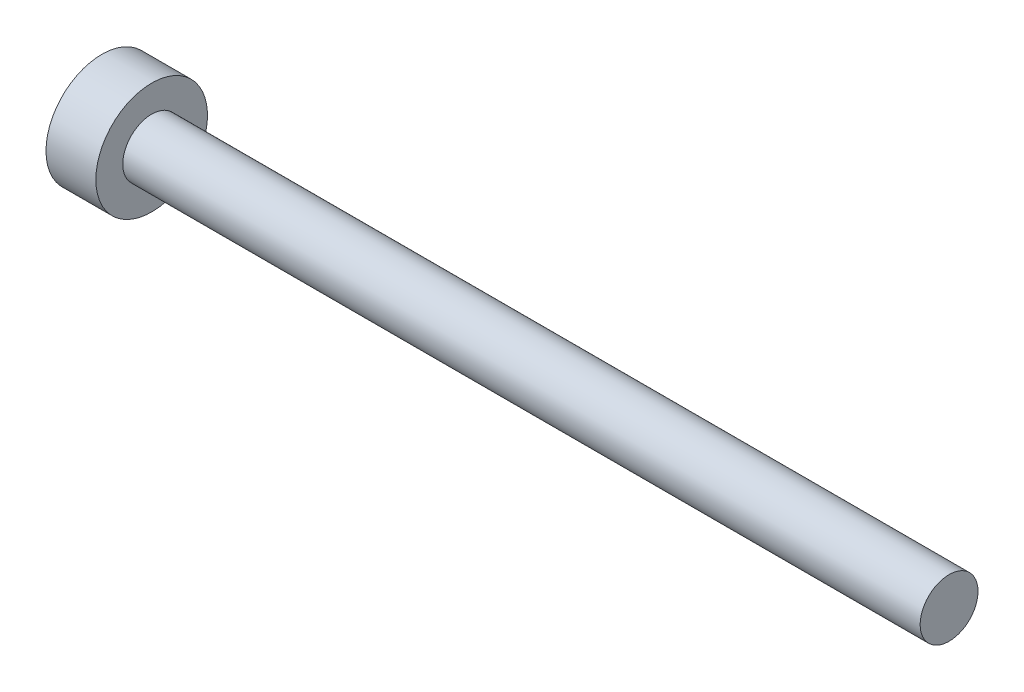
ISO-10303-21;
HEADER;
FILE_DESCRIPTION(('STEP AP214'),'2;1');
FILE_NAME('part.step','',(''),(''),'','','');
FILE_SCHEMA(('AUTOMOTIVE_DESIGN { 1 0 10303 214 1 1 1 1 }'));
ENDSEC;
DATA;
#1=APPLICATION_CONTEXT('core data for automotive mechanical design processes');
#2=APPLICATION_PROTOCOL_DEFINITION('international standard','automotive_design',2000,#1);
#3=PRODUCT_CONTEXT('',#1,'mechanical');
#4=PRODUCT('Part','Part','',(#3));
#5=PRODUCT_RELATED_PRODUCT_CATEGORY('part','',(#4));
#6=PRODUCT_DEFINITION_FORMATION('','',#4);
#7=PRODUCT_DEFINITION_CONTEXT('part definition',#1,'design');
#8=PRODUCT_DEFINITION('design','',#6,#7);
#9=PRODUCT_DEFINITION_SHAPE('','',#8);
#10=(LENGTH_UNIT() NAMED_UNIT(*) SI_UNIT(.MILLI.,.METRE.));
#11=(NAMED_UNIT(*) PLANE_ANGLE_UNIT() SI_UNIT($,.RADIAN.));
#12=(NAMED_UNIT(*) SI_UNIT($,.STERADIAN.) SOLID_ANGLE_UNIT());
#13=UNCERTAINTY_MEASURE_WITH_UNIT(LENGTH_MEASURE(1.E-05),#10,'distance_accuracy_value','');
#14=(GEOMETRIC_REPRESENTATION_CONTEXT(3) GLOBAL_UNCERTAINTY_ASSIGNED_CONTEXT((#13)) GLOBAL_UNIT_ASSIGNED_CONTEXT((#10,
#11,#12)) REPRESENTATION_CONTEXT('',''));
#15=CARTESIAN_POINT('',(0.,0.,0.));
#16=DIRECTION('',(0.,0.,1.));
#17=DIRECTION('',(1.,0.,0.));
#18=AXIS2_PLACEMENT_3D('',#15,#16,#17);
#19=CARTESIAN_POINT('',(40.,0.,0.));
#20=DIRECTION('',(-1.,0.,0.));
#21=DIRECTION('',(0.,0.,1.));
#22=AXIS2_PLACEMENT_3D('',#19,#20,#21);
#23=CYLINDRICAL_SURFACE('',#22,1.45);
#24=CARTESIAN_POINT('',(40.,0.,0.));
#25=DIRECTION('',(1.,0.,0.));
#26=DIRECTION('',(0.,0.,-1.));
#27=AXIS2_PLACEMENT_3D('',#24,#25,#26);
#28=CIRCLE('',#27,1.45);
#29=CARTESIAN_POINT('',(40.,0.,-1.45));
#30=VERTEX_POINT('',#29);
#31=EDGE_CURVE('E11',#30,#30,#28,.T.);
#32=ORIENTED_EDGE('',*,*,#31,.F.);
#33=EDGE_LOOP('',(#32));
#34=FACE_BOUND('',#33,.T.);
#35=CARTESIAN_POINT('',(0.,0.,0.));
#36=DIRECTION('',(1.,0.,0.));
#37=DIRECTION('',(0.,0.,-1.));
#38=AXIS2_PLACEMENT_3D('',#35,#36,#37);
#39=CIRCLE('',#38,1.45);
#40=CARTESIAN_POINT('',(0.,0.,-1.45));
#41=VERTEX_POINT('',#40);
#42=EDGE_CURVE('E46',#41,#41,#39,.T.);
#43=ORIENTED_EDGE('',*,*,#42,.T.);
#44=EDGE_LOOP('',(#43));
#45=FACE_BOUND('',#44,.T.);
#46=ADVANCED_FACE('F43',(#34,#45),#23,.T.);
#47=CARTESIAN_POINT('',(40.,0.,0.));
#48=DIRECTION('',(1.,0.,0.));
#49=DIRECTION('',(0.,0.,-1.));
#50=AXIS2_PLACEMENT_3D('',#47,#48,#49);
#51=PLANE('',#50);
#52=ORIENTED_EDGE('',*,*,#31,.T.);
#53=EDGE_LOOP('',(#52));
#54=FACE_BOUND('',#53,.T.);
#55=ADVANCED_FACE('F194',(#54),#51,.T.);
#56=CARTESIAN_POINT('',(-2.5,0.,0.));
#57=DIRECTION('',(1.,0.,0.));
#58=DIRECTION('',(0.,0.,-1.));
#59=AXIS2_PLACEMENT_3D('',#56,#57,#58);
#60=CYLINDRICAL_SURFACE('',#59,2.8);
#61=CARTESIAN_POINT('',(-2.5,0.,0.));
#62=DIRECTION('',(-1.,0.,0.));
#63=DIRECTION('',(0.,0.,1.));
#64=AXIS2_PLACEMENT_3D('',#61,#62,#63);
#65=CIRCLE('',#64,2.8);
#66=CARTESIAN_POINT('',(-2.5,0.,2.8));
#67=VERTEX_POINT('',#66);
#68=EDGE_CURVE('E167',#67,#67,#65,.T.);
#69=ORIENTED_EDGE('',*,*,#68,.F.);
#70=EDGE_LOOP('',(#69));
#71=FACE_BOUND('',#70,.T.);
#72=CARTESIAN_POINT('',(0.,0.,0.));
#73=DIRECTION('',(-1.,0.,0.));
#74=DIRECTION('',(0.,0.,1.));
#75=AXIS2_PLACEMENT_3D('',#72,#73,#74);
#76=CIRCLE('',#75,2.8);
#77=CARTESIAN_POINT('',(0.,0.,2.8));
#78=VERTEX_POINT('',#77);
#79=EDGE_CURVE('E157',#78,#78,#76,.T.);
#80=ORIENTED_EDGE('',*,*,#79,.T.);
#81=EDGE_LOOP('',(#80));
#82=FACE_BOUND('',#81,.T.);
#83=ADVANCED_FACE('F175',(#71,#82),#60,.T.);
#84=CARTESIAN_POINT('',(-2.5,0.,0.));
#85=DIRECTION('',(-1.,0.,0.));
#86=DIRECTION('',(0.,0.,1.));
#87=AXIS2_PLACEMENT_3D('',#84,#85,#86);
#88=PLANE('',#87);
#89=DIRECTION('',(0.,0.,1.));
#90=VECTOR('',#89,1.);
#91=CARTESIAN_POINT('',(-2.5,-1.5,-0.86602540378444));
#92=LINE('',#91,#90);
#93=CARTESIAN_POINT('',(-2.5,-1.5,-0.86602540378444));
#94=VERTEX_POINT('',#93);
#95=CARTESIAN_POINT('',(-2.5,-1.5,0.866025403784439));
#96=VERTEX_POINT('',#95);
#97=EDGE_CURVE('E58',#94,#96,#92,.T.);
#98=ORIENTED_EDGE('',*,*,#97,.F.);
#99=DIRECTION('',(0.,-0.866025403784439,0.5));
#100=VECTOR('',#99,1.);
#101=CARTESIAN_POINT('',(-2.5,0.,-1.73205080756888));
#102=LINE('',#101,#100);
#103=CARTESIAN_POINT('',(-2.5,0.,-1.73205080756888));
#104=VERTEX_POINT('',#103);
#105=EDGE_CURVE('E151',#104,#94,#102,.T.);
#106=ORIENTED_EDGE('',*,*,#105,.F.);
#107=DIRECTION('',(0.,-0.866025403784438,-0.5));
#108=VECTOR('',#107,1.);
#109=CARTESIAN_POINT('',(-2.5,1.5,-0.866025403784439));
#110=LINE('',#109,#108);
#111=CARTESIAN_POINT('',(-2.5,1.5,-0.866025403784439));
#112=VERTEX_POINT('',#111);
#113=EDGE_CURVE('E148',#112,#104,#110,.T.);
#114=ORIENTED_EDGE('',*,*,#113,.F.);
#115=DIRECTION('',(0.,0.,-1.));
#116=VECTOR('',#115,1.);
#117=CARTESIAN_POINT('',(-2.5,1.5,0.866025403784438));
#118=LINE('',#117,#116);
#119=CARTESIAN_POINT('',(-2.5,1.5,0.866025403784438));
#120=VERTEX_POINT('',#119);
#121=EDGE_CURVE('E106',#120,#112,#118,.T.);
#122=ORIENTED_EDGE('',*,*,#121,.F.);
#123=DIRECTION('',(0.,0.866025403784439,-0.5));
#124=VECTOR('',#123,1.);
#125=CARTESIAN_POINT('',(-2.5,0.,1.73205080756888));
#126=LINE('',#125,#124);
#127=CARTESIAN_POINT('',(-2.5,0.,1.73205080756888));
#128=VERTEX_POINT('',#127);
#129=EDGE_CURVE('E142',#128,#120,#126,.T.);
#130=ORIENTED_EDGE('',*,*,#129,.F.);
#131=DIRECTION('',(0.,0.866025403784438,0.500000000000001));
#132=VECTOR('',#131,1.);
#133=CARTESIAN_POINT('',(-2.5,-1.5,0.866025403784438));
#134=LINE('',#133,#132);
#135=EDGE_CURVE('E138',#96,#128,#134,.T.);
#136=ORIENTED_EDGE('',*,*,#135,.F.);
#137=EDGE_LOOP('',(#98,#106,#114,#122,#130,#136));
#138=FACE_BOUND('',#137,.T.);
#139=ORIENTED_EDGE('',*,*,#68,.T.);
#140=EDGE_LOOP('',(#139));
#141=FACE_BOUND('',#140,.T.);
#142=ADVANCED_FACE('F180',(#138,#141),#88,.T.);
#143=CARTESIAN_POINT('',(0.,0.,0.));
#144=DIRECTION('',(-1.,0.,0.));
#145=DIRECTION('',(0.,0.,1.));
#146=AXIS2_PLACEMENT_3D('',#143,#144,#145);
#147=PLANE('',#146);
#148=ORIENTED_EDGE('',*,*,#42,.F.);
#149=EDGE_LOOP('',(#148));
#150=FACE_BOUND('',#149,.T.);
#151=ORIENTED_EDGE('',*,*,#79,.F.);
#152=EDGE_LOOP('',(#151));
#153=FACE_BOUND('',#152,.T.);
#154=ADVANCED_FACE('F177',(#150,#153),#147,.F.);
#155=CARTESIAN_POINT('',(-0.5,-1.5,-0.86602540378444));
#156=DIRECTION('',(0.,-1.,0.));
#157=DIRECTION('',(0.,0.,-1.));
#158=AXIS2_PLACEMENT_3D('',#155,#156,#157);
#159=PLANE('',#158);
#160=ORIENTED_EDGE('',*,*,#97,.T.);
#161=DIRECTION('',(-1.,0.,0.));
#162=VECTOR('',#161,1.);
#163=CARTESIAN_POINT('',(-0.5,-1.5,0.866025403784438));
#164=LINE('',#163,#162);
#165=CARTESIAN_POINT('',(-0.5,-1.5,0.866025403784438));
#166=VERTEX_POINT('',#165);
#167=EDGE_CURVE('E88',#166,#96,#164,.T.);
#168=ORIENTED_EDGE('',*,*,#167,.F.);
#169=DIRECTION('',(0.,0.,1.));
#170=VECTOR('',#169,1.);
#171=CARTESIAN_POINT('',(-0.5,-1.5,-0.86602540378444));
#172=LINE('',#171,#170);
#173=CARTESIAN_POINT('',(-0.5,-1.5,-0.86602540378444));
#174=VERTEX_POINT('',#173);
#175=EDGE_CURVE('E154',#174,#166,#172,.T.);
#176=ORIENTED_EDGE('',*,*,#175,.F.);
#177=DIRECTION('',(-1.,0.,0.));
#178=VECTOR('',#177,1.);
#179=CARTESIAN_POINT('',(-0.5,-1.5,-0.86602540378444));
#180=LINE('',#179,#178);
#181=EDGE_CURVE('E66',#174,#94,#180,.T.);
#182=ORIENTED_EDGE('',*,*,#181,.T.);
#183=EDGE_LOOP('',(#160,#168,#176,#182));
#184=FACE_BOUND('',#183,.T.);
#185=ADVANCED_FACE('F179',(#184),#159,.F.);
#186=CARTESIAN_POINT('',(-0.5,0.,-1.73205080756888));
#187=DIRECTION('',(0.,-0.5,-0.866025403784439));
#188=DIRECTION('',(0.,0.866025403784439,-0.5));
#189=AXIS2_PLACEMENT_3D('',#186,#187,#188);
#190=PLANE('',#189);
#191=ORIENTED_EDGE('',*,*,#105,.T.);
#192=ORIENTED_EDGE('',*,*,#181,.F.);
#193=DIRECTION('',(0.,-0.866025403784439,0.5));
#194=VECTOR('',#193,1.);
#195=CARTESIAN_POINT('',(-0.5,0.,-1.73205080756888));
#196=LINE('',#195,#194);
#197=CARTESIAN_POINT('',(-0.5,0.,-1.73205080756888));
#198=VERTEX_POINT('',#197);
#199=EDGE_CURVE('E120',#198,#174,#196,.T.);
#200=ORIENTED_EDGE('',*,*,#199,.F.);
#201=DIRECTION('',(-1.,0.,0.));
#202=VECTOR('',#201,1.);
#203=CARTESIAN_POINT('',(-0.5,0.,-1.73205080756888));
#204=LINE('',#203,#202);
#205=EDGE_CURVE('E111',#198,#104,#204,.T.);
#206=ORIENTED_EDGE('',*,*,#205,.T.);
#207=EDGE_LOOP('',(#191,#192,#200,#206));
#208=FACE_BOUND('',#207,.T.);
#209=ADVANCED_FACE('F187',(#208),#190,.F.);
#210=CARTESIAN_POINT('',(-0.5,1.5,-0.866025403784439));
#211=DIRECTION('',(0.,0.5,-0.866025403784438));
#212=DIRECTION('',(0.,0.866025403784438,0.5));
#213=AXIS2_PLACEMENT_3D('',#210,#211,#212);
#214=PLANE('',#213);
#215=ORIENTED_EDGE('',*,*,#113,.T.);
#216=ORIENTED_EDGE('',*,*,#205,.F.);
#217=DIRECTION('',(0.,-0.866025403784438,-0.5));
#218=VECTOR('',#217,1.);
#219=CARTESIAN_POINT('',(-0.5,1.5,-0.866025403784439));
#220=LINE('',#219,#218);
#221=CARTESIAN_POINT('',(-0.5,1.5,-0.866025403784439));
#222=VERTEX_POINT('',#221);
#223=EDGE_CURVE('E115',#222,#198,#220,.T.);
#224=ORIENTED_EDGE('',*,*,#223,.F.);
#225=DIRECTION('',(-1.,0.,0.));
#226=VECTOR('',#225,1.);
#227=CARTESIAN_POINT('',(-0.5,1.5,-0.866025403784439));
#228=LINE('',#227,#226);
#229=EDGE_CURVE('E99',#222,#112,#228,.T.);
#230=ORIENTED_EDGE('',*,*,#229,.T.);
#231=EDGE_LOOP('',(#215,#216,#224,#230));
#232=FACE_BOUND('',#231,.T.);
#233=ADVANCED_FACE('F116',(#232),#214,.F.);
#234=CARTESIAN_POINT('',(-0.5,1.5,0.866025403784438));
#235=DIRECTION('',(0.,1.,0.));
#236=DIRECTION('',(0.,0.,1.));
#237=AXIS2_PLACEMENT_3D('',#234,#235,#236);
#238=PLANE('',#237);
#239=ORIENTED_EDGE('',*,*,#121,.T.);
#240=ORIENTED_EDGE('',*,*,#229,.F.);
#241=DIRECTION('',(0.,0.,-1.));
#242=VECTOR('',#241,1.);
#243=CARTESIAN_POINT('',(-0.5,1.5,0.866025403784438));
#244=LINE('',#243,#242);
#245=CARTESIAN_POINT('',(-0.5,1.5,0.866025403784438));
#246=VERTEX_POINT('',#245);
#247=EDGE_CURVE('E103',#246,#222,#244,.T.);
#248=ORIENTED_EDGE('',*,*,#247,.F.);
#249=DIRECTION('',(-1.,0.,0.));
#250=VECTOR('',#249,1.);
#251=CARTESIAN_POINT('',(-0.5,1.5,0.866025403784438));
#252=LINE('',#251,#250);
#253=EDGE_CURVE('E112',#246,#120,#252,.T.);
#254=ORIENTED_EDGE('',*,*,#253,.T.);
#255=EDGE_LOOP('',(#239,#240,#248,#254));
#256=FACE_BOUND('',#255,.T.);
#257=ADVANCED_FACE('F101',(#256),#238,.F.);
#258=CARTESIAN_POINT('',(-0.5,0.,1.73205080756888));
#259=DIRECTION('',(0.,0.5,0.866025403784439));
#260=DIRECTION('',(0.,-0.866025403784439,0.5));
#261=AXIS2_PLACEMENT_3D('',#258,#259,#260);
#262=PLANE('',#261);
#263=ORIENTED_EDGE('',*,*,#129,.T.);
#264=ORIENTED_EDGE('',*,*,#253,.F.);
#265=DIRECTION('',(0.,0.866025403784439,-0.5));
#266=VECTOR('',#265,1.);
#267=CARTESIAN_POINT('',(-0.5,0.,1.73205080756888));
#268=LINE('',#267,#266);
#269=CARTESIAN_POINT('',(-0.5,0.,1.73205080756888));
#270=VERTEX_POINT('',#269);
#271=EDGE_CURVE('E126',#270,#246,#268,.T.);
#272=ORIENTED_EDGE('',*,*,#271,.F.);
#273=DIRECTION('',(-1.,0.,0.));
#274=VECTOR('',#273,1.);
#275=CARTESIAN_POINT('',(-0.5,0.,1.73205080756888));
#276=LINE('',#275,#274);
#277=EDGE_CURVE('E162',#270,#128,#276,.T.);
#278=ORIENTED_EDGE('',*,*,#277,.T.);
#279=EDGE_LOOP('',(#263,#264,#272,#278));
#280=FACE_BOUND('',#279,.T.);
#281=ADVANCED_FACE('F249',(#280),#262,.F.);
#282=CARTESIAN_POINT('',(-0.5,-1.5,0.866025403784438));
#283=DIRECTION('',(0.,-0.500000000000001,0.866025403784438));
#284=DIRECTION('',(0.,-0.866025403784438,-0.500000000000001));
#285=AXIS2_PLACEMENT_3D('',#282,#283,#284);
#286=PLANE('',#285);
#287=ORIENTED_EDGE('',*,*,#135,.T.);
#288=ORIENTED_EDGE('',*,*,#277,.F.);
#289=DIRECTION('',(0.,0.866025403784438,0.500000000000001));
#290=VECTOR('',#289,1.);
#291=CARTESIAN_POINT('',(-0.5,-1.5,0.866025403784438));
#292=LINE('',#291,#290);
#293=EDGE_CURVE('E130',#166,#270,#292,.T.);
#294=ORIENTED_EDGE('',*,*,#293,.F.);
#295=ORIENTED_EDGE('',*,*,#167,.T.);
#296=EDGE_LOOP('',(#287,#288,#294,#295));
#297=FACE_BOUND('',#296,.T.);
#298=ADVANCED_FACE('F258',(#297),#286,.F.);
#299=CARTESIAN_POINT('',(-0.5,0.,0.));
#300=DIRECTION('',(-1.,0.,0.));
#301=DIRECTION('',(0.,0.,1.));
#302=AXIS2_PLACEMENT_3D('',#299,#300,#301);
#303=PLANE('',#302);
#304=ORIENTED_EDGE('',*,*,#175,.T.);
#305=ORIENTED_EDGE('',*,*,#293,.T.);
#306=ORIENTED_EDGE('',*,*,#271,.T.);
#307=ORIENTED_EDGE('',*,*,#247,.T.);
#308=ORIENTED_EDGE('',*,*,#223,.T.);
#309=ORIENTED_EDGE('',*,*,#199,.T.);
#310=EDGE_LOOP('',(#304,#305,#306,#307,#308,#309));
#311=FACE_BOUND('',#310,.T.);
#312=ADVANCED_FACE('F123',(#311),#303,.T.);
#313=CLOSED_SHELL('',(#46,#55,#83,#142,#154,#185,#209,#233,#257,#281,#298,#312));
#314=MANIFOLD_SOLID_BREP('B2',#313);
#315=ADVANCED_BREP_SHAPE_REPRESENTATION('',(#18,#314),#14);
#316=SHAPE_DEFINITION_REPRESENTATION(#9,#315);
ENDSEC;
END-ISO-10303-21;
